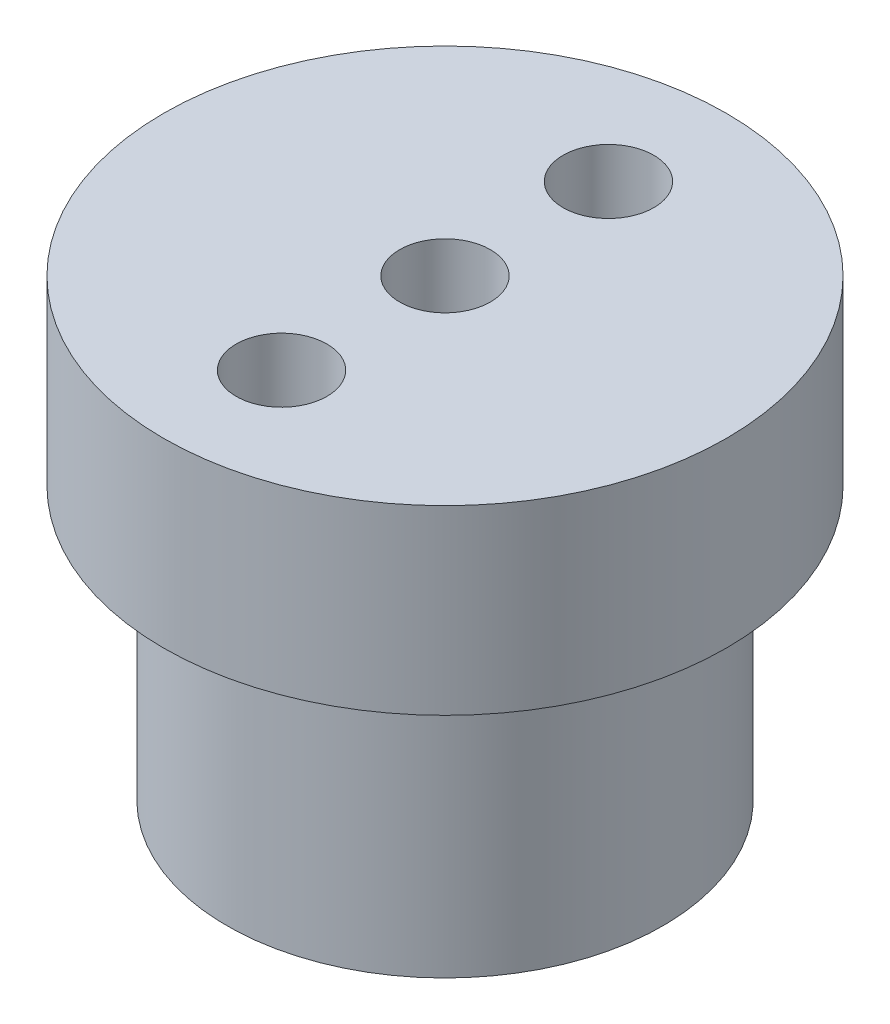
ISO-10303-21;
HEADER;
FILE_DESCRIPTION(('STEP AP214'),'2;1');
FILE_NAME('part.step','',(''),(''),'','','');
FILE_SCHEMA(('AUTOMOTIVE_DESIGN { 1 0 10303 214 1 1 1 1 }'));
ENDSEC;
DATA;
#1=APPLICATION_CONTEXT('core data for automotive mechanical design processes');
#2=APPLICATION_PROTOCOL_DEFINITION('international standard','automotive_design',2000,#1);
#3=PRODUCT_CONTEXT('',#1,'mechanical');
#4=PRODUCT('Part','Part','',(#3));
#5=PRODUCT_RELATED_PRODUCT_CATEGORY('part','',(#4));
#6=PRODUCT_DEFINITION_FORMATION('','',#4);
#7=PRODUCT_DEFINITION_CONTEXT('part definition',#1,'design');
#8=PRODUCT_DEFINITION('design','',#6,#7);
#9=PRODUCT_DEFINITION_SHAPE('','',#8);
#10=(LENGTH_UNIT() NAMED_UNIT(*) SI_UNIT(.MILLI.,.METRE.));
#11=(NAMED_UNIT(*) PLANE_ANGLE_UNIT() SI_UNIT($,.RADIAN.));
#12=(NAMED_UNIT(*) SI_UNIT($,.STERADIAN.) SOLID_ANGLE_UNIT());
#13=UNCERTAINTY_MEASURE_WITH_UNIT(LENGTH_MEASURE(1.E-05),#10,'distance_accuracy_value','');
#14=(GEOMETRIC_REPRESENTATION_CONTEXT(3) GLOBAL_UNCERTAINTY_ASSIGNED_CONTEXT((#13)) GLOBAL_UNIT_ASSIGNED_CONTEXT((#10,
#11,#12)) REPRESENTATION_CONTEXT('',''));
#15=CARTESIAN_POINT('',(0.,0.,0.));
#16=DIRECTION('',(0.,0.,1.));
#17=DIRECTION('',(1.,0.,0.));
#18=AXIS2_PLACEMENT_3D('',#15,#16,#17);
#19=CARTESIAN_POINT('',(0.,0.,0.));
#20=DIRECTION('',(0.,-1.,0.));
#21=DIRECTION('',(0.,0.,-1.));
#22=AXIS2_PLACEMENT_3D('',#19,#20,#21);
#23=CYLINDRICAL_SURFACE('',#22,1.25);
#24=CARTESIAN_POINT('',(0.,0.,0.));
#25=DIRECTION('',(0.,-1.,0.));
#26=DIRECTION('',(0.,0.,-1.));
#27=AXIS2_PLACEMENT_3D('',#24,#25,#26);
#28=CIRCLE('',#27,1.25);
#29=CARTESIAN_POINT('',(0.,0.,-1.25));
#30=VERTEX_POINT('',#29);
#31=EDGE_CURVE('E53',#30,#30,#28,.T.);
#32=ORIENTED_EDGE('',*,*,#31,.T.);
#33=EDGE_LOOP('',(#32));
#34=FACE_BOUND('',#33,.T.);
#35=CARTESIAN_POINT('',(0.,12.5,0.));
#36=DIRECTION('',(0.,-1.,0.));
#37=DIRECTION('',(0.,0.,-1.));
#38=AXIS2_PLACEMENT_3D('',#35,#36,#37);
#39=CIRCLE('',#38,1.25);
#40=CARTESIAN_POINT('',(0.,12.5,-1.25));
#41=VERTEX_POINT('',#40);
#42=EDGE_CURVE('E10',#41,#41,#39,.T.);
#43=ORIENTED_EDGE('',*,*,#42,.F.);
#44=EDGE_LOOP('',(#43));
#45=FACE_BOUND('',#44,.T.);
#46=ADVANCED_FACE('F31',(#34,#45),#23,.F.);
#47=CARTESIAN_POINT('',(1.25,12.5,0.));
#48=DIRECTION('',(0.,1.,0.));
#49=DIRECTION('',(0.,0.,1.));
#50=AXIS2_PLACEMENT_3D('',#47,#48,#49);
#51=PLANE('',#50);
#52=CARTESIAN_POINT('',(0.,12.5,-4.5));
#53=DIRECTION('',(0.,1.,0.));
#54=DIRECTION('',(0.,0.,1.));
#55=AXIS2_PLACEMENT_3D('',#52,#53,#54);
#56=CIRCLE('',#55,1.25);
#57=CARTESIAN_POINT('',(0.,12.5,-3.25));
#58=VERTEX_POINT('',#57);
#59=EDGE_CURVE('E63',#58,#58,#56,.T.);
#60=ORIENTED_EDGE('',*,*,#59,.F.);
#61=EDGE_LOOP('',(#60));
#62=FACE_BOUND('',#61,.T.);
#63=CARTESIAN_POINT('',(0.,12.5,4.5));
#64=DIRECTION('',(0.,1.,0.));
#65=DIRECTION('',(0.,0.,-1.));
#66=AXIS2_PLACEMENT_3D('',#63,#64,#65);
#67=CIRCLE('',#66,1.25);
#68=CARTESIAN_POINT('',(0.,12.5,3.25));
#69=VERTEX_POINT('',#68);
#70=EDGE_CURVE('E57',#69,#69,#67,.T.);
#71=ORIENTED_EDGE('',*,*,#70,.F.);
#72=EDGE_LOOP('',(#71));
#73=FACE_BOUND('',#72,.T.);
#74=ORIENTED_EDGE('',*,*,#42,.T.);
#75=EDGE_LOOP('',(#74));
#76=FACE_BOUND('',#75,.T.);
#77=CARTESIAN_POINT('',(0.,12.5,0.));
#78=DIRECTION('',(0.,-1.,0.));
#79=DIRECTION('',(0.,0.,-1.));
#80=AXIS2_PLACEMENT_3D('',#77,#78,#79);
#81=CIRCLE('',#80,7.75);
#82=CARTESIAN_POINT('',(0.,12.5,-7.75));
#83=VERTEX_POINT('',#82);
#84=EDGE_CURVE('E37',#83,#83,#81,.T.);
#85=ORIENTED_EDGE('',*,*,#84,.F.);
#86=EDGE_LOOP('',(#85));
#87=FACE_BOUND('',#86,.T.);
#88=ADVANCED_FACE('F78',(#62,#73,#76,#87),#51,.T.);
#89=CARTESIAN_POINT('',(0.,0.,0.));
#90=DIRECTION('',(0.,-1.,0.));
#91=DIRECTION('',(0.,0.,-1.));
#92=AXIS2_PLACEMENT_3D('',#89,#90,#91);
#93=CYLINDRICAL_SURFACE('',#92,7.75);
#94=ORIENTED_EDGE('',*,*,#84,.T.);
#95=EDGE_LOOP('',(#94));
#96=FACE_BOUND('',#95,.T.);
#97=CARTESIAN_POINT('',(0.,7.5,0.));
#98=DIRECTION('',(0.,-1.,0.));
#99=DIRECTION('',(0.,0.,-1.));
#100=AXIS2_PLACEMENT_3D('',#97,#98,#99);
#101=CIRCLE('',#100,7.75);
#102=CARTESIAN_POINT('',(0.,7.5,-7.75));
#103=VERTEX_POINT('',#102);
#104=EDGE_CURVE('E41',#103,#103,#101,.T.);
#105=ORIENTED_EDGE('',*,*,#104,.F.);
#106=EDGE_LOOP('',(#105));
#107=FACE_BOUND('',#106,.T.);
#108=ADVANCED_FACE('F81',(#96,#107),#93,.T.);
#109=CARTESIAN_POINT('',(7.75,7.5,0.));
#110=DIRECTION('',(0.,-1.,0.));
#111=DIRECTION('',(0.,0.,-1.));
#112=AXIS2_PLACEMENT_3D('',#109,#110,#111);
#113=PLANE('',#112);
#114=ORIENTED_EDGE('',*,*,#104,.T.);
#115=EDGE_LOOP('',(#114));
#116=FACE_BOUND('',#115,.T.);
#117=CARTESIAN_POINT('',(0.,7.5,0.));
#118=DIRECTION('',(0.,-1.,0.));
#119=DIRECTION('',(0.,0.,-1.));
#120=AXIS2_PLACEMENT_3D('',#117,#118,#119);
#121=CIRCLE('',#120,6.);
#122=CARTESIAN_POINT('',(0.,7.5,-6.));
#123=VERTEX_POINT('',#122);
#124=EDGE_CURVE('E45',#123,#123,#121,.T.);
#125=ORIENTED_EDGE('',*,*,#124,.F.);
#126=EDGE_LOOP('',(#125));
#127=FACE_BOUND('',#126,.T.);
#128=ADVANCED_FACE('F118',(#116,#127),#113,.T.);
#129=CARTESIAN_POINT('',(0.,0.,0.));
#130=DIRECTION('',(0.,-1.,0.));
#131=DIRECTION('',(0.,0.,-1.));
#132=AXIS2_PLACEMENT_3D('',#129,#130,#131);
#133=CYLINDRICAL_SURFACE('',#132,6.);
#134=ORIENTED_EDGE('',*,*,#124,.T.);
#135=EDGE_LOOP('',(#134));
#136=FACE_BOUND('',#135,.T.);
#137=CARTESIAN_POINT('',(0.,0.,0.));
#138=DIRECTION('',(0.,-1.,0.));
#139=DIRECTION('',(0.,0.,-1.));
#140=AXIS2_PLACEMENT_3D('',#137,#138,#139);
#141=CIRCLE('',#140,6.);
#142=CARTESIAN_POINT('',(0.,0.,-6.));
#143=VERTEX_POINT('',#142);
#144=EDGE_CURVE('E50',#143,#143,#141,.T.);
#145=ORIENTED_EDGE('',*,*,#144,.F.);
#146=EDGE_LOOP('',(#145));
#147=FACE_BOUND('',#146,.T.);
#148=ADVANCED_FACE('F96',(#136,#147),#133,.T.);
#149=CARTESIAN_POINT('',(6.,0.,0.));
#150=DIRECTION('',(0.,-1.,0.));
#151=DIRECTION('',(0.,0.,-1.));
#152=AXIS2_PLACEMENT_3D('',#149,#150,#151);
#153=PLANE('',#152);
#154=ORIENTED_EDGE('',*,*,#144,.T.);
#155=EDGE_LOOP('',(#154));
#156=FACE_BOUND('',#155,.T.);
#157=ORIENTED_EDGE('',*,*,#31,.F.);
#158=EDGE_LOOP('',(#157));
#159=FACE_BOUND('',#158,.T.);
#160=ADVANCED_FACE('F87',(#156,#159),#153,.T.);
#161=CARTESIAN_POINT('',(0.,2.5,4.5));
#162=DIRECTION('',(0.,1.,0.));
#163=DIRECTION('',(0.,0.,1.));
#164=AXIS2_PLACEMENT_3D('',#161,#162,#163);
#165=CYLINDRICAL_SURFACE('',#164,1.25);
#166=CARTESIAN_POINT('',(0.,2.5,4.5));
#167=DIRECTION('',(0.,1.,0.));
#168=DIRECTION('',(0.,0.,-1.));
#169=AXIS2_PLACEMENT_3D('',#166,#167,#168);
#170=CIRCLE('',#169,1.25);
#171=CARTESIAN_POINT('',(0.,2.5,3.25));
#172=VERTEX_POINT('',#171);
#173=EDGE_CURVE('E60',#172,#172,#170,.T.);
#174=ORIENTED_EDGE('',*,*,#173,.F.);
#175=EDGE_LOOP('',(#174));
#176=FACE_BOUND('',#175,.T.);
#177=ORIENTED_EDGE('',*,*,#70,.T.);
#178=EDGE_LOOP('',(#177));
#179=FACE_BOUND('',#178,.T.);
#180=ADVANCED_FACE('F85',(#176,#179),#165,.F.);
#181=CARTESIAN_POINT('',(0.,2.5,4.5));
#182=DIRECTION('',(0.,-1.,0.));
#183=DIRECTION('',(0.,0.,-1.));
#184=AXIS2_PLACEMENT_3D('',#181,#182,#183);
#185=PLANE('',#184);
#186=ORIENTED_EDGE('',*,*,#173,.T.);
#187=EDGE_LOOP('',(#186));
#188=FACE_BOUND('',#187,.T.);
#189=ADVANCED_FACE('F74',(#188),#185,.F.);
#190=CARTESIAN_POINT('',(0.,2.5,-4.5));
#191=DIRECTION('',(0.,1.,0.));
#192=DIRECTION('',(0.,0.,1.));
#193=AXIS2_PLACEMENT_3D('',#190,#191,#192);
#194=CYLINDRICAL_SURFACE('',#193,1.25);
#195=CARTESIAN_POINT('',(0.,2.5,-4.5));
#196=DIRECTION('',(0.,1.,0.));
#197=DIRECTION('',(0.,0.,1.));
#198=AXIS2_PLACEMENT_3D('',#195,#196,#197);
#199=CIRCLE('',#198,1.25);
#200=CARTESIAN_POINT('',(0.,2.5,-3.25));
#201=VERTEX_POINT('',#200);
#202=EDGE_CURVE('E56',#201,#201,#199,.T.);
#203=ORIENTED_EDGE('',*,*,#202,.F.);
#204=EDGE_LOOP('',(#203));
#205=FACE_BOUND('',#204,.T.);
#206=ORIENTED_EDGE('',*,*,#59,.T.);
#207=EDGE_LOOP('',(#206));
#208=FACE_BOUND('',#207,.T.);
#209=ADVANCED_FACE('F71',(#205,#208),#194,.F.);
#210=CARTESIAN_POINT('',(0.,2.5,-4.5));
#211=DIRECTION('',(0.,1.,0.));
#212=DIRECTION('',(0.,0.,1.));
#213=AXIS2_PLACEMENT_3D('',#210,#211,#212);
#214=PLANE('',#213);
#215=ORIENTED_EDGE('',*,*,#202,.T.);
#216=EDGE_LOOP('',(#215));
#217=FACE_BOUND('',#216,.T.);
#218=ADVANCED_FACE('F69',(#217),#214,.T.);
#219=CLOSED_SHELL('',(#46,#88,#108,#128,#148,#160,#180,#189,#209,#218));
#220=MANIFOLD_SOLID_BREP('B2',#219);
#221=ADVANCED_BREP_SHAPE_REPRESENTATION('',(#18,#220),#14);
#222=SHAPE_DEFINITION_REPRESENTATION(#9,#221);
ENDSEC;
END-ISO-10303-21;
